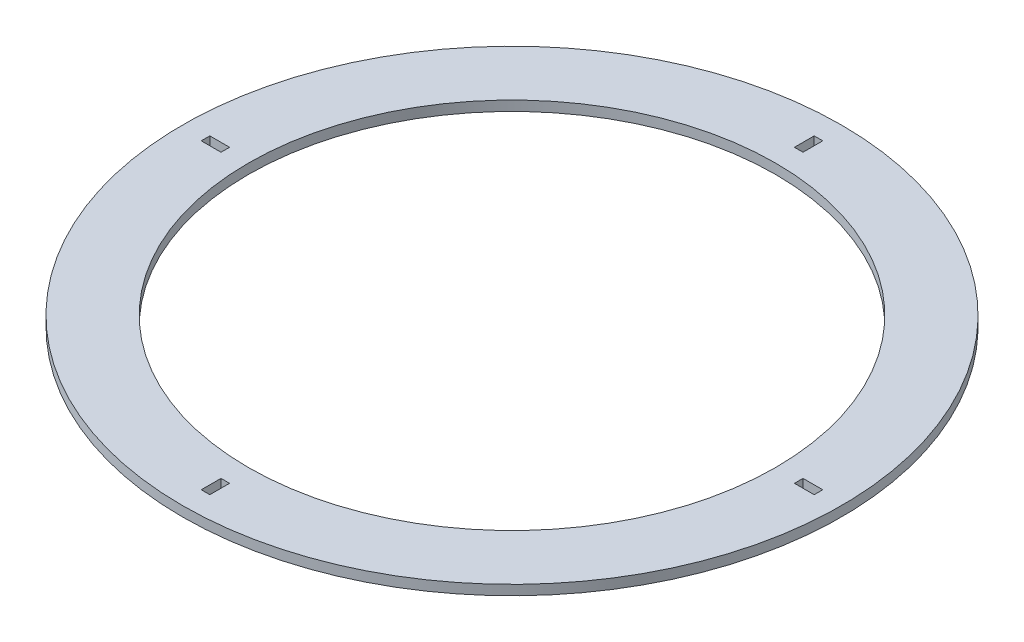
ISO-10303-21;
HEADER;
FILE_DESCRIPTION(('STEP AP214'),'2;1');
FILE_NAME('part.step','',(''),(''),'','','');
FILE_SCHEMA(('AUTOMOTIVE_DESIGN { 1 0 10303 214 1 1 1 1 }'));
ENDSEC;
DATA;
#1=APPLICATION_CONTEXT('core data for automotive mechanical design processes');
#2=APPLICATION_PROTOCOL_DEFINITION('international standard','automotive_design',2000,#1);
#3=PRODUCT_CONTEXT('',#1,'mechanical');
#4=PRODUCT('Part','Part','',(#3));
#5=PRODUCT_RELATED_PRODUCT_CATEGORY('part','',(#4));
#6=PRODUCT_DEFINITION_FORMATION('','',#4);
#7=PRODUCT_DEFINITION_CONTEXT('part definition',#1,'design');
#8=PRODUCT_DEFINITION('design','',#6,#7);
#9=PRODUCT_DEFINITION_SHAPE('','',#8);
#10=(LENGTH_UNIT() NAMED_UNIT(*) SI_UNIT(.MILLI.,.METRE.));
#11=(NAMED_UNIT(*) PLANE_ANGLE_UNIT() SI_UNIT($,.RADIAN.));
#12=(NAMED_UNIT(*) SI_UNIT($,.STERADIAN.) SOLID_ANGLE_UNIT());
#13=UNCERTAINTY_MEASURE_WITH_UNIT(LENGTH_MEASURE(1.E-05),#10,'distance_accuracy_value','');
#14=(GEOMETRIC_REPRESENTATION_CONTEXT(3) GLOBAL_UNCERTAINTY_ASSIGNED_CONTEXT((#13)) GLOBAL_UNIT_ASSIGNED_CONTEXT((#10,
#11,#12)) REPRESENTATION_CONTEXT('',''));
#15=CARTESIAN_POINT('',(0.,0.,0.));
#16=DIRECTION('',(0.,0.,1.));
#17=DIRECTION('',(1.,0.,0.));
#18=AXIS2_PLACEMENT_3D('',#15,#16,#17);
#19=CARTESIAN_POINT('',(0.,3.,0.));
#20=DIRECTION('',(0.,1.,0.));
#21=DIRECTION('',(0.,0.,1.));
#22=AXIS2_PLACEMENT_3D('',#19,#20,#21);
#23=PLANE('',#22);
#24=DIRECTION('',(-1.,0.,0.));
#25=VECTOR('',#24,1.);
#26=CARTESIAN_POINT('',(-93.,3.,-1.30000000000032));
#27=LINE('',#26,#25);
#28=CARTESIAN_POINT('',(-87.,3.,-1.3000000000003));
#29=VERTEX_POINT('',#28);
#30=CARTESIAN_POINT('',(-93.,3.,-1.30000000000032));
#31=VERTEX_POINT('',#30);
#32=EDGE_CURVE('E48',#29,#31,#27,.T.);
#33=ORIENTED_EDGE('',*,*,#32,.F.);
#34=DIRECTION('',(0.,0.,-1.));
#35=VECTOR('',#34,1.);
#36=CARTESIAN_POINT('',(-87.,3.,1.2999999999997));
#37=LINE('',#36,#35);
#38=CARTESIAN_POINT('',(-87.,3.,1.2999999999997));
#39=VERTEX_POINT('',#38);
#40=EDGE_CURVE('E167',#39,#29,#37,.T.);
#41=ORIENTED_EDGE('',*,*,#40,.F.);
#42=DIRECTION('',(1.,0.,0.));
#43=VECTOR('',#42,1.);
#44=CARTESIAN_POINT('',(-93.,3.,1.29999999999968));
#45=LINE('',#44,#43);
#46=CARTESIAN_POINT('',(-93.,3.,1.29999999999968));
#47=VERTEX_POINT('',#46);
#48=EDGE_CURVE('E170',#47,#39,#45,.T.);
#49=ORIENTED_EDGE('',*,*,#48,.F.);
#50=DIRECTION('',(0.,0.,1.));
#51=VECTOR('',#50,1.);
#52=CARTESIAN_POINT('',(-93.,3.,1.29999999999968));
#53=LINE('',#52,#51);
#54=EDGE_CURVE('E176',#31,#47,#53,.T.);
#55=ORIENTED_EDGE('',*,*,#54,.F.);
#56=EDGE_LOOP('',(#33,#41,#49,#55));
#57=FACE_BOUND('',#56,.T.);
#58=DIRECTION('',(0.,0.,-1.));
#59=VECTOR('',#58,1.);
#60=CARTESIAN_POINT('',(1.3,3.,-93.));
#61=LINE('',#60,#59);
#62=CARTESIAN_POINT('',(1.3,3.,-87.));
#63=VERTEX_POINT('',#62);
#64=CARTESIAN_POINT('',(1.3,3.,-93.));
#65=VERTEX_POINT('',#64);
#66=EDGE_CURVE('E56',#63,#65,#61,.T.);
#67=ORIENTED_EDGE('',*,*,#66,.F.);
#68=DIRECTION('',(1.,0.,0.));
#69=VECTOR('',#68,1.);
#70=CARTESIAN_POINT('',(-1.3,3.,-87.));
#71=LINE('',#70,#69);
#72=CARTESIAN_POINT('',(-1.3,3.,-87.));
#73=VERTEX_POINT('',#72);
#74=EDGE_CURVE('E191',#73,#63,#71,.T.);
#75=ORIENTED_EDGE('',*,*,#74,.F.);
#76=DIRECTION('',(0.,0.,1.));
#77=VECTOR('',#76,1.);
#78=CARTESIAN_POINT('',(-1.3,3.,-93.));
#79=LINE('',#78,#77);
#80=CARTESIAN_POINT('',(-1.3,3.,-93.));
#81=VERTEX_POINT('',#80);
#82=EDGE_CURVE('E206',#81,#73,#79,.T.);
#83=ORIENTED_EDGE('',*,*,#82,.F.);
#84=DIRECTION('',(-1.,0.,0.));
#85=VECTOR('',#84,1.);
#86=CARTESIAN_POINT('',(-1.3,3.,-93.));
#87=LINE('',#86,#85);
#88=EDGE_CURVE('E202',#65,#81,#87,.T.);
#89=ORIENTED_EDGE('',*,*,#88,.F.);
#90=EDGE_LOOP('',(#67,#75,#83,#89));
#91=FACE_BOUND('',#90,.T.);
#92=DIRECTION('',(1.,0.,0.));
#93=VECTOR('',#92,1.);
#94=CARTESIAN_POINT('',(93.,3.,1.30000000000097));
#95=LINE('',#94,#93);
#96=CARTESIAN_POINT('',(87.,3.,1.30000000000091));
#97=VERTEX_POINT('',#96);
#98=CARTESIAN_POINT('',(93.,3.,1.30000000000097));
#99=VERTEX_POINT('',#98);
#100=EDGE_CURVE('E231',#97,#99,#95,.T.);
#101=ORIENTED_EDGE('',*,*,#100,.F.);
#102=DIRECTION('',(0.,0.,1.));
#103=VECTOR('',#102,1.);
#104=CARTESIAN_POINT('',(87.,3.,-1.29999999999909));
#105=LINE('',#104,#103);
#106=CARTESIAN_POINT('',(87.,3.,-1.29999999999909));
#107=VERTEX_POINT('',#106);
#108=EDGE_CURVE('E221',#107,#97,#105,.T.);
#109=ORIENTED_EDGE('',*,*,#108,.F.);
#110=DIRECTION('',(-1.,0.,0.));
#111=VECTOR('',#110,1.);
#112=CARTESIAN_POINT('',(93.,3.,-1.29999999999903));
#113=LINE('',#112,#111);
#114=CARTESIAN_POINT('',(93.,3.,-1.29999999999903));
#115=VERTEX_POINT('',#114);
#116=EDGE_CURVE('E236',#115,#107,#113,.T.);
#117=ORIENTED_EDGE('',*,*,#116,.F.);
#118=DIRECTION('',(0.,0.,-1.));
#119=VECTOR('',#118,1.);
#120=CARTESIAN_POINT('',(93.,3.,-1.29999999999903));
#121=LINE('',#120,#119);
#122=EDGE_CURVE('E233',#99,#115,#121,.T.);
#123=ORIENTED_EDGE('',*,*,#122,.F.);
#124=EDGE_LOOP('',(#101,#109,#117,#123));
#125=FACE_BOUND('',#124,.T.);
#126=DIRECTION('',(0.,0.,1.));
#127=VECTOR('',#126,1.);
#128=CARTESIAN_POINT('',(-1.3,3.,93.));
#129=LINE('',#128,#127);
#130=CARTESIAN_POINT('',(-1.3,3.,87.));
#131=VERTEX_POINT('',#130);
#132=CARTESIAN_POINT('',(-1.3,3.,93.));
#133=VERTEX_POINT('',#132);
#134=EDGE_CURVE('E183',#131,#133,#129,.T.);
#135=ORIENTED_EDGE('',*,*,#134,.F.);
#136=DIRECTION('',(-1.,0.,0.));
#137=VECTOR('',#136,1.);
#138=CARTESIAN_POINT('',(1.3,3.,87.));
#139=LINE('',#138,#137);
#140=CARTESIAN_POINT('',(1.3,3.,87.));
#141=VERTEX_POINT('',#140);
#142=EDGE_CURVE('E252',#141,#131,#139,.T.);
#143=ORIENTED_EDGE('',*,*,#142,.F.);
#144=DIRECTION('',(0.,0.,-1.));
#145=VECTOR('',#144,1.);
#146=CARTESIAN_POINT('',(1.3,3.,93.));
#147=LINE('',#146,#145);
#148=CARTESIAN_POINT('',(1.3,3.,93.));
#149=VERTEX_POINT('',#148);
#150=EDGE_CURVE('E266',#149,#141,#147,.T.);
#151=ORIENTED_EDGE('',*,*,#150,.F.);
#152=DIRECTION('',(1.,0.,0.));
#153=VECTOR('',#152,1.);
#154=CARTESIAN_POINT('',(1.3,3.,93.));
#155=LINE('',#154,#153);
#156=EDGE_CURVE('E263',#133,#149,#155,.T.);
#157=ORIENTED_EDGE('',*,*,#156,.F.);
#158=EDGE_LOOP('',(#135,#143,#151,#157));
#159=FACE_BOUND('',#158,.T.);
#160=CARTESIAN_POINT('',(0.,3.,0.));
#161=DIRECTION('',(0.,1.,0.));
#162=DIRECTION('',(0.,0.,1.));
#163=AXIS2_PLACEMENT_3D('',#160,#161,#162);
#164=CIRCLE('',#163,100.);
#165=CARTESIAN_POINT('',(0.,3.,100.));
#166=VERTEX_POINT('',#165);
#167=EDGE_CURVE('E11',#166,#166,#164,.T.);
#168=ORIENTED_EDGE('',*,*,#167,.T.);
#169=EDGE_LOOP('',(#168));
#170=FACE_BOUND('',#169,.T.);
#171=CARTESIAN_POINT('',(0.,3.,0.));
#172=DIRECTION('',(0.,1.,0.));
#173=DIRECTION('',(0.,0.,1.));
#174=AXIS2_PLACEMENT_3D('',#171,#172,#173);
#175=CIRCLE('',#174,80.);
#176=CARTESIAN_POINT('',(0.,3.,80.));
#177=VERTEX_POINT('',#176);
#178=EDGE_CURVE('E280',#177,#177,#175,.T.);
#179=ORIENTED_EDGE('',*,*,#178,.F.);
#180=EDGE_LOOP('',(#179));
#181=FACE_BOUND('',#180,.T.);
#182=ADVANCED_FACE('F33',(#57,#91,#125,#159,#170,#181),#23,.T.);
#183=CARTESIAN_POINT('',(0.,0.,0.));
#184=DIRECTION('',(0.,1.,0.));
#185=DIRECTION('',(0.,0.,1.));
#186=AXIS2_PLACEMENT_3D('',#183,#184,#185);
#187=PLANE('',#186);
#188=DIRECTION('',(0.,0.,-1.));
#189=VECTOR('',#188,1.);
#190=CARTESIAN_POINT('',(-87.,0.,1.2999999999997));
#191=LINE('',#190,#189);
#192=CARTESIAN_POINT('',(-87.,0.,1.2999999999997));
#193=VERTEX_POINT('',#192);
#194=CARTESIAN_POINT('',(-87.,0.,-1.3000000000003));
#195=VERTEX_POINT('',#194);
#196=EDGE_CURVE('E154',#193,#195,#191,.T.);
#197=ORIENTED_EDGE('',*,*,#196,.T.);
#198=DIRECTION('',(-1.,0.,0.));
#199=VECTOR('',#198,1.);
#200=CARTESIAN_POINT('',(-93.,0.,-1.30000000000032));
#201=LINE('',#200,#199);
#202=CARTESIAN_POINT('',(-93.,0.,-1.30000000000032));
#203=VERTEX_POINT('',#202);
#204=EDGE_CURVE('E148',#195,#203,#201,.T.);
#205=ORIENTED_EDGE('',*,*,#204,.T.);
#206=DIRECTION('',(0.,0.,1.));
#207=VECTOR('',#206,1.);
#208=CARTESIAN_POINT('',(-93.,0.,1.29999999999968));
#209=LINE('',#208,#207);
#210=CARTESIAN_POINT('',(-93.,0.,1.29999999999968));
#211=VERTEX_POINT('',#210);
#212=EDGE_CURVE('E158',#203,#211,#209,.T.);
#213=ORIENTED_EDGE('',*,*,#212,.T.);
#214=DIRECTION('',(1.,0.,0.));
#215=VECTOR('',#214,1.);
#216=CARTESIAN_POINT('',(-93.,0.,1.29999999999968));
#217=LINE('',#216,#215);
#218=EDGE_CURVE('E162',#211,#193,#217,.T.);
#219=ORIENTED_EDGE('',*,*,#218,.T.);
#220=EDGE_LOOP('',(#197,#205,#213,#219));
#221=FACE_BOUND('',#220,.T.);
#222=DIRECTION('',(1.,0.,0.));
#223=VECTOR('',#222,1.);
#224=CARTESIAN_POINT('',(-1.3,0.,-87.));
#225=LINE('',#224,#223);
#226=CARTESIAN_POINT('',(-1.3,0.,-87.));
#227=VERTEX_POINT('',#226);
#228=CARTESIAN_POINT('',(1.3,0.,-87.));
#229=VERTEX_POINT('',#228);
#230=EDGE_CURVE('E197',#227,#229,#225,.T.);
#231=ORIENTED_EDGE('',*,*,#230,.T.);
#232=DIRECTION('',(0.,0.,-1.));
#233=VECTOR('',#232,1.);
#234=CARTESIAN_POINT('',(1.3,0.,-93.));
#235=LINE('',#234,#233);
#236=CARTESIAN_POINT('',(1.3,0.,-93.));
#237=VERTEX_POINT('',#236);
#238=EDGE_CURVE('E187',#229,#237,#235,.T.);
#239=ORIENTED_EDGE('',*,*,#238,.T.);
#240=DIRECTION('',(-1.,0.,0.));
#241=VECTOR('',#240,1.);
#242=CARTESIAN_POINT('',(-1.3,0.,-93.));
#243=LINE('',#242,#241);
#244=CARTESIAN_POINT('',(-1.3,0.,-93.));
#245=VERTEX_POINT('',#244);
#246=EDGE_CURVE('E190',#237,#245,#243,.T.);
#247=ORIENTED_EDGE('',*,*,#246,.T.);
#248=DIRECTION('',(0.,0.,1.));
#249=VECTOR('',#248,1.);
#250=CARTESIAN_POINT('',(-1.3,0.,-93.));
#251=LINE('',#250,#249);
#252=EDGE_CURVE('E194',#245,#227,#251,.T.);
#253=ORIENTED_EDGE('',*,*,#252,.T.);
#254=EDGE_LOOP('',(#231,#239,#247,#253));
#255=FACE_BOUND('',#254,.T.);
#256=DIRECTION('',(0.,0.,1.));
#257=VECTOR('',#256,1.);
#258=CARTESIAN_POINT('',(87.,0.,-1.29999999999909));
#259=LINE('',#258,#257);
#260=CARTESIAN_POINT('',(87.,0.,-1.29999999999909));
#261=VERTEX_POINT('',#260);
#262=CARTESIAN_POINT('',(87.,0.,1.30000000000091));
#263=VERTEX_POINT('',#262);
#264=EDGE_CURVE('E227',#261,#263,#259,.T.);
#265=ORIENTED_EDGE('',*,*,#264,.T.);
#266=DIRECTION('',(1.,0.,0.));
#267=VECTOR('',#266,1.);
#268=CARTESIAN_POINT('',(93.,0.,1.30000000000097));
#269=LINE('',#268,#267);
#270=CARTESIAN_POINT('',(93.,0.,1.30000000000097));
#271=VERTEX_POINT('',#270);
#272=EDGE_CURVE('E217',#263,#271,#269,.T.);
#273=ORIENTED_EDGE('',*,*,#272,.T.);
#274=DIRECTION('',(0.,0.,-1.));
#275=VECTOR('',#274,1.);
#276=CARTESIAN_POINT('',(93.,0.,-1.29999999999903));
#277=LINE('',#276,#275);
#278=CARTESIAN_POINT('',(93.,0.,-1.29999999999903));
#279=VERTEX_POINT('',#278);
#280=EDGE_CURVE('E220',#271,#279,#277,.T.);
#281=ORIENTED_EDGE('',*,*,#280,.T.);
#282=DIRECTION('',(-1.,0.,0.));
#283=VECTOR('',#282,1.);
#284=CARTESIAN_POINT('',(93.,0.,-1.29999999999903));
#285=LINE('',#284,#283);
#286=EDGE_CURVE('E224',#279,#261,#285,.T.);
#287=ORIENTED_EDGE('',*,*,#286,.T.);
#288=EDGE_LOOP('',(#265,#273,#281,#287));
#289=FACE_BOUND('',#288,.T.);
#290=DIRECTION('',(-1.,0.,0.));
#291=VECTOR('',#290,1.);
#292=CARTESIAN_POINT('',(1.3,0.,87.));
#293=LINE('',#292,#291);
#294=CARTESIAN_POINT('',(1.3,0.,87.));
#295=VERTEX_POINT('',#294);
#296=CARTESIAN_POINT('',(-1.3,0.,87.));
#297=VERTEX_POINT('',#296);
#298=EDGE_CURVE('E258',#295,#297,#293,.T.);
#299=ORIENTED_EDGE('',*,*,#298,.T.);
#300=DIRECTION('',(0.,0.,1.));
#301=VECTOR('',#300,1.);
#302=CARTESIAN_POINT('',(-1.3,0.,93.));
#303=LINE('',#302,#301);
#304=CARTESIAN_POINT('',(-1.3,0.,93.));
#305=VERTEX_POINT('',#304);
#306=EDGE_CURVE('E248',#297,#305,#303,.T.);
#307=ORIENTED_EDGE('',*,*,#306,.T.);
#308=DIRECTION('',(1.,0.,0.));
#309=VECTOR('',#308,1.);
#310=CARTESIAN_POINT('',(1.3,0.,93.));
#311=LINE('',#310,#309);
#312=CARTESIAN_POINT('',(1.3,0.,93.));
#313=VERTEX_POINT('',#312);
#314=EDGE_CURVE('E251',#305,#313,#311,.T.);
#315=ORIENTED_EDGE('',*,*,#314,.T.);
#316=DIRECTION('',(0.,0.,-1.));
#317=VECTOR('',#316,1.);
#318=CARTESIAN_POINT('',(1.3,0.,93.));
#319=LINE('',#318,#317);
#320=EDGE_CURVE('E255',#313,#295,#319,.T.);
#321=ORIENTED_EDGE('',*,*,#320,.T.);
#322=EDGE_LOOP('',(#299,#307,#315,#321));
#323=FACE_BOUND('',#322,.T.);
#324=CARTESIAN_POINT('',(0.,0.,0.));
#325=DIRECTION('',(0.,1.,0.));
#326=DIRECTION('',(0.,0.,1.));
#327=AXIS2_PLACEMENT_3D('',#324,#325,#326);
#328=CIRCLE('',#327,100.);
#329=CARTESIAN_POINT('',(0.,0.,100.));
#330=VERTEX_POINT('',#329);
#331=EDGE_CURVE('E37',#330,#330,#328,.T.);
#332=ORIENTED_EDGE('',*,*,#331,.F.);
#333=EDGE_LOOP('',(#332));
#334=FACE_BOUND('',#333,.T.);
#335=CARTESIAN_POINT('',(0.,0.,0.));
#336=DIRECTION('',(0.,1.,0.));
#337=DIRECTION('',(0.,0.,1.));
#338=AXIS2_PLACEMENT_3D('',#335,#336,#337);
#339=CIRCLE('',#338,80.);
#340=CARTESIAN_POINT('',(0.,0.,80.));
#341=VERTEX_POINT('',#340);
#342=EDGE_CURVE('E273',#341,#341,#339,.T.);
#343=ORIENTED_EDGE('',*,*,#342,.T.);
#344=EDGE_LOOP('',(#343));
#345=FACE_BOUND('',#344,.T.);
#346=ADVANCED_FACE('F164',(#221,#255,#289,#323,#334,#345),#187,.F.);
#347=CARTESIAN_POINT('',(0.,3.,0.));
#348=DIRECTION('',(0.,-1.,0.));
#349=DIRECTION('',(0.,0.,-1.));
#350=AXIS2_PLACEMENT_3D('',#347,#348,#349);
#351=CYLINDRICAL_SURFACE('',#350,100.);
#352=ORIENTED_EDGE('',*,*,#167,.F.);
#353=EDGE_LOOP('',(#352));
#354=FACE_BOUND('',#353,.T.);
#355=ORIENTED_EDGE('',*,*,#331,.T.);
#356=EDGE_LOOP('',(#355));
#357=FACE_BOUND('',#356,.T.);
#358=ADVANCED_FACE('F35',(#354,#357),#351,.T.);
#359=CARTESIAN_POINT('',(0.,3.,0.));
#360=DIRECTION('',(0.,-1.,0.));
#361=DIRECTION('',(0.,0.,-1.));
#362=AXIS2_PLACEMENT_3D('',#359,#360,#361);
#363=CYLINDRICAL_SURFACE('',#362,80.);
#364=ORIENTED_EDGE('',*,*,#178,.T.);
#365=EDGE_LOOP('',(#364));
#366=FACE_BOUND('',#365,.T.);
#367=ORIENTED_EDGE('',*,*,#342,.F.);
#368=EDGE_LOOP('',(#367));
#369=FACE_BOUND('',#368,.T.);
#370=ADVANCED_FACE('F287',(#366,#369),#363,.F.);
#371=CARTESIAN_POINT('',(-1.3,0.,93.));
#372=DIRECTION('',(-1.,0.,0.));
#373=DIRECTION('',(0.,0.,1.));
#374=AXIS2_PLACEMENT_3D('',#371,#372,#373);
#375=PLANE('',#374);
#376=ORIENTED_EDGE('',*,*,#134,.T.);
#377=DIRECTION('',(0.,1.,0.));
#378=VECTOR('',#377,1.);
#379=CARTESIAN_POINT('',(-1.3,0.,93.));
#380=LINE('',#379,#378);
#381=EDGE_CURVE('E261',#305,#133,#380,.T.);
#382=ORIENTED_EDGE('',*,*,#381,.F.);
#383=ORIENTED_EDGE('',*,*,#306,.F.);
#384=DIRECTION('',(0.,1.,0.));
#385=VECTOR('',#384,1.);
#386=CARTESIAN_POINT('',(-1.3,0.,87.));
#387=LINE('',#386,#385);
#388=EDGE_CURVE('E271',#297,#131,#387,.T.);
#389=ORIENTED_EDGE('',*,*,#388,.T.);
#390=EDGE_LOOP('',(#376,#382,#383,#389));
#391=FACE_BOUND('',#390,.T.);
#392=ADVANCED_FACE('F289',(#391),#375,.F.);
#393=CARTESIAN_POINT('',(1.3,0.,87.));
#394=DIRECTION('',(0.,0.,-1.));
#395=DIRECTION('',(-1.,0.,0.));
#396=AXIS2_PLACEMENT_3D('',#393,#394,#395);
#397=PLANE('',#396);
#398=ORIENTED_EDGE('',*,*,#142,.T.);
#399=ORIENTED_EDGE('',*,*,#388,.F.);
#400=ORIENTED_EDGE('',*,*,#298,.F.);
#401=DIRECTION('',(0.,1.,0.));
#402=VECTOR('',#401,1.);
#403=CARTESIAN_POINT('',(1.3,0.,87.));
#404=LINE('',#403,#402);
#405=EDGE_CURVE('E274',#295,#141,#404,.T.);
#406=ORIENTED_EDGE('',*,*,#405,.T.);
#407=EDGE_LOOP('',(#398,#399,#400,#406));
#408=FACE_BOUND('',#407,.T.);
#409=ADVANCED_FACE('F296',(#408),#397,.F.);
#410=CARTESIAN_POINT('',(1.3,0.,93.));
#411=DIRECTION('',(1.,0.,0.));
#412=DIRECTION('',(0.,0.,-1.));
#413=AXIS2_PLACEMENT_3D('',#410,#411,#412);
#414=PLANE('',#413);
#415=ORIENTED_EDGE('',*,*,#150,.T.);
#416=ORIENTED_EDGE('',*,*,#405,.F.);
#417=ORIENTED_EDGE('',*,*,#320,.F.);
#418=DIRECTION('',(0.,1.,0.));
#419=VECTOR('',#418,1.);
#420=CARTESIAN_POINT('',(1.3,0.,93.));
#421=LINE('',#420,#419);
#422=EDGE_CURVE('E276',#313,#149,#421,.T.);
#423=ORIENTED_EDGE('',*,*,#422,.T.);
#424=EDGE_LOOP('',(#415,#416,#417,#423));
#425=FACE_BOUND('',#424,.T.);
#426=ADVANCED_FACE('F336',(#425),#414,.F.);
#427=CARTESIAN_POINT('',(1.3,0.,93.));
#428=DIRECTION('',(0.,0.,1.));
#429=DIRECTION('',(1.,0.,0.));
#430=AXIS2_PLACEMENT_3D('',#427,#428,#429);
#431=PLANE('',#430);
#432=ORIENTED_EDGE('',*,*,#156,.T.);
#433=ORIENTED_EDGE('',*,*,#422,.F.);
#434=ORIENTED_EDGE('',*,*,#314,.F.);
#435=ORIENTED_EDGE('',*,*,#381,.T.);
#436=EDGE_LOOP('',(#432,#433,#434,#435));
#437=FACE_BOUND('',#436,.T.);
#438=ADVANCED_FACE('F330',(#437),#431,.F.);
#439=CARTESIAN_POINT('',(93.,0.,1.30000000000097));
#440=DIRECTION('',(0.,0.,1.));
#441=DIRECTION('',(1.,0.,0.));
#442=AXIS2_PLACEMENT_3D('',#439,#440,#441);
#443=PLANE('',#442);
#444=ORIENTED_EDGE('',*,*,#100,.T.);
#445=DIRECTION('',(0.,1.,0.));
#446=VECTOR('',#445,1.);
#447=CARTESIAN_POINT('',(93.,0.,1.30000000000097));
#448=LINE('',#447,#446);
#449=EDGE_CURVE('E230',#271,#99,#448,.T.);
#450=ORIENTED_EDGE('',*,*,#449,.F.);
#451=ORIENTED_EDGE('',*,*,#272,.F.);
#452=DIRECTION('',(0.,1.,0.));
#453=VECTOR('',#452,1.);
#454=CARTESIAN_POINT('',(87.,0.,1.30000000000091));
#455=LINE('',#454,#453);
#456=EDGE_CURVE('E203',#263,#97,#455,.T.);
#457=ORIENTED_EDGE('',*,*,#456,.T.);
#458=EDGE_LOOP('',(#444,#450,#451,#457));
#459=FACE_BOUND('',#458,.T.);
#460=ADVANCED_FACE('F343',(#459),#443,.F.);
#461=CARTESIAN_POINT('',(87.,0.,-1.29999999999909));
#462=DIRECTION('',(-1.,0.,0.));
#463=DIRECTION('',(0.,0.,1.));
#464=AXIS2_PLACEMENT_3D('',#461,#462,#463);
#465=PLANE('',#464);
#466=ORIENTED_EDGE('',*,*,#108,.T.);
#467=ORIENTED_EDGE('',*,*,#456,.F.);
#468=ORIENTED_EDGE('',*,*,#264,.F.);
#469=DIRECTION('',(0.,1.,0.));
#470=VECTOR('',#469,1.);
#471=CARTESIAN_POINT('',(87.,0.,-1.29999999999909));
#472=LINE('',#471,#470);
#473=EDGE_CURVE('E242',#261,#107,#472,.T.);
#474=ORIENTED_EDGE('',*,*,#473,.T.);
#475=EDGE_LOOP('',(#466,#467,#468,#474));
#476=FACE_BOUND('',#475,.T.);
#477=ADVANCED_FACE('F349',(#476),#465,.F.);
#478=CARTESIAN_POINT('',(93.,0.,-1.29999999999903));
#479=DIRECTION('',(0.,0.,-1.));
#480=DIRECTION('',(-1.,0.,0.));
#481=AXIS2_PLACEMENT_3D('',#478,#479,#480);
#482=PLANE('',#481);
#483=ORIENTED_EDGE('',*,*,#116,.T.);
#484=ORIENTED_EDGE('',*,*,#473,.F.);
#485=ORIENTED_EDGE('',*,*,#286,.F.);
#486=DIRECTION('',(0.,1.,0.));
#487=VECTOR('',#486,1.);
#488=CARTESIAN_POINT('',(93.,0.,-1.29999999999903));
#489=LINE('',#488,#487);
#490=EDGE_CURVE('E244',#279,#115,#489,.T.);
#491=ORIENTED_EDGE('',*,*,#490,.T.);
#492=EDGE_LOOP('',(#483,#484,#485,#491));
#493=FACE_BOUND('',#492,.T.);
#494=ADVANCED_FACE('F355',(#493),#482,.F.);
#495=CARTESIAN_POINT('',(93.,0.,-1.29999999999903));
#496=DIRECTION('',(1.,0.,0.));
#497=DIRECTION('',(0.,0.,-1.));
#498=AXIS2_PLACEMENT_3D('',#495,#496,#497);
#499=PLANE('',#498);
#500=ORIENTED_EDGE('',*,*,#122,.T.);
#501=ORIENTED_EDGE('',*,*,#490,.F.);
#502=ORIENTED_EDGE('',*,*,#280,.F.);
#503=ORIENTED_EDGE('',*,*,#449,.T.);
#504=EDGE_LOOP('',(#500,#501,#502,#503));
#505=FACE_BOUND('',#504,.T.);
#506=ADVANCED_FACE('F351',(#505),#499,.F.);
#507=CARTESIAN_POINT('',(1.3,0.,-93.));
#508=DIRECTION('',(1.,0.,0.));
#509=DIRECTION('',(0.,0.,-1.));
#510=AXIS2_PLACEMENT_3D('',#507,#508,#509);
#511=PLANE('',#510);
#512=ORIENTED_EDGE('',*,*,#66,.T.);
#513=DIRECTION('',(0.,1.,0.));
#514=VECTOR('',#513,1.);
#515=CARTESIAN_POINT('',(1.3,0.,-93.));
#516=LINE('',#515,#514);
#517=EDGE_CURVE('E200',#237,#65,#516,.T.);
#518=ORIENTED_EDGE('',*,*,#517,.F.);
#519=ORIENTED_EDGE('',*,*,#238,.F.);
#520=DIRECTION('',(0.,1.,0.));
#521=VECTOR('',#520,1.);
#522=CARTESIAN_POINT('',(1.3,0.,-87.));
#523=LINE('',#522,#521);
#524=EDGE_CURVE('E177',#229,#63,#523,.T.);
#525=ORIENTED_EDGE('',*,*,#524,.T.);
#526=EDGE_LOOP('',(#512,#518,#519,#525));
#527=FACE_BOUND('',#526,.T.);
#528=ADVANCED_FACE('F354',(#527),#511,.F.);
#529=CARTESIAN_POINT('',(-1.3,0.,-87.));
#530=DIRECTION('',(0.,0.,1.));
#531=DIRECTION('',(1.,0.,0.));
#532=AXIS2_PLACEMENT_3D('',#529,#530,#531);
#533=PLANE('',#532);
#534=ORIENTED_EDGE('',*,*,#74,.T.);
#535=ORIENTED_EDGE('',*,*,#524,.F.);
#536=ORIENTED_EDGE('',*,*,#230,.F.);
#537=DIRECTION('',(0.,1.,0.));
#538=VECTOR('',#537,1.);
#539=CARTESIAN_POINT('',(-1.3,0.,-87.));
#540=LINE('',#539,#538);
#541=EDGE_CURVE('E212',#227,#73,#540,.T.);
#542=ORIENTED_EDGE('',*,*,#541,.T.);
#543=EDGE_LOOP('',(#534,#535,#536,#542));
#544=FACE_BOUND('',#543,.T.);
#545=ADVANCED_FACE('F365',(#544),#533,.F.);
#546=CARTESIAN_POINT('',(-1.3,0.,-93.));
#547=DIRECTION('',(-1.,0.,0.));
#548=DIRECTION('',(0.,0.,1.));
#549=AXIS2_PLACEMENT_3D('',#546,#547,#548);
#550=PLANE('',#549);
#551=ORIENTED_EDGE('',*,*,#82,.T.);
#552=ORIENTED_EDGE('',*,*,#541,.F.);
#553=ORIENTED_EDGE('',*,*,#252,.F.);
#554=DIRECTION('',(0.,1.,0.));
#555=VECTOR('',#554,1.);
#556=CARTESIAN_POINT('',(-1.3,0.,-93.));
#557=LINE('',#556,#555);
#558=EDGE_CURVE('E214',#245,#81,#557,.T.);
#559=ORIENTED_EDGE('',*,*,#558,.T.);
#560=EDGE_LOOP('',(#551,#552,#553,#559));
#561=FACE_BOUND('',#560,.T.);
#562=ADVANCED_FACE('F369',(#561),#550,.F.);
#563=CARTESIAN_POINT('',(-1.3,0.,-93.));
#564=DIRECTION('',(0.,0.,-1.));
#565=DIRECTION('',(-1.,0.,0.));
#566=AXIS2_PLACEMENT_3D('',#563,#564,#565);
#567=PLANE('',#566);
#568=ORIENTED_EDGE('',*,*,#88,.T.);
#569=ORIENTED_EDGE('',*,*,#558,.F.);
#570=ORIENTED_EDGE('',*,*,#246,.F.);
#571=ORIENTED_EDGE('',*,*,#517,.T.);
#572=EDGE_LOOP('',(#568,#569,#570,#571));
#573=FACE_BOUND('',#572,.T.);
#574=ADVANCED_FACE('F366',(#573),#567,.F.);
#575=CARTESIAN_POINT('',(-93.,0.,-1.30000000000032));
#576=DIRECTION('',(0.,0.,-1.));
#577=DIRECTION('',(-1.,0.,0.));
#578=AXIS2_PLACEMENT_3D('',#575,#576,#577);
#579=PLANE('',#578);
#580=ORIENTED_EDGE('',*,*,#32,.T.);
#581=DIRECTION('',(0.,1.,0.));
#582=VECTOR('',#581,1.);
#583=CARTESIAN_POINT('',(-93.,0.,-1.30000000000032));
#584=LINE('',#583,#582);
#585=EDGE_CURVE('E144',#203,#31,#584,.T.);
#586=ORIENTED_EDGE('',*,*,#585,.F.);
#587=ORIENTED_EDGE('',*,*,#204,.F.);
#588=DIRECTION('',(0.,1.,0.));
#589=VECTOR('',#588,1.);
#590=CARTESIAN_POINT('',(-87.,0.,-1.3000000000003));
#591=LINE('',#590,#589);
#592=EDGE_CURVE('E181',#195,#29,#591,.T.);
#593=ORIENTED_EDGE('',*,*,#592,.T.);
#594=EDGE_LOOP('',(#580,#586,#587,#593));
#595=FACE_BOUND('',#594,.T.);
#596=ADVANCED_FACE('F146',(#595),#579,.F.);
#597=CARTESIAN_POINT('',(-87.,0.,1.2999999999997));
#598=DIRECTION('',(1.,0.,0.));
#599=DIRECTION('',(0.,0.,-1.));
#600=AXIS2_PLACEMENT_3D('',#597,#598,#599);
#601=PLANE('',#600);
#602=ORIENTED_EDGE('',*,*,#40,.T.);
#603=ORIENTED_EDGE('',*,*,#592,.F.);
#604=ORIENTED_EDGE('',*,*,#196,.F.);
#605=DIRECTION('',(0.,1.,0.));
#606=VECTOR('',#605,1.);
#607=CARTESIAN_POINT('',(-87.,0.,1.2999999999997));
#608=LINE('',#607,#606);
#609=EDGE_CURVE('E184',#193,#39,#608,.T.);
#610=ORIENTED_EDGE('',*,*,#609,.T.);
#611=EDGE_LOOP('',(#602,#603,#604,#610));
#612=FACE_BOUND('',#611,.T.);
#613=ADVANCED_FACE('F379',(#612),#601,.F.);
#614=CARTESIAN_POINT('',(-93.,0.,1.29999999999968));
#615=DIRECTION('',(0.,0.,1.));
#616=DIRECTION('',(1.,0.,0.));
#617=AXIS2_PLACEMENT_3D('',#614,#615,#616);
#618=PLANE('',#617);
#619=ORIENTED_EDGE('',*,*,#48,.T.);
#620=ORIENTED_EDGE('',*,*,#609,.F.);
#621=ORIENTED_EDGE('',*,*,#218,.F.);
#622=DIRECTION('',(0.,1.,0.));
#623=VECTOR('',#622,1.);
#624=CARTESIAN_POINT('',(-93.,0.,1.29999999999968));
#625=LINE('',#624,#623);
#626=EDGE_CURVE('E153',#211,#47,#625,.T.);
#627=ORIENTED_EDGE('',*,*,#626,.T.);
#628=EDGE_LOOP('',(#619,#620,#621,#627));
#629=FACE_BOUND('',#628,.T.);
#630=ADVANCED_FACE('F382',(#629),#618,.F.);
#631=CARTESIAN_POINT('',(-93.,0.,1.29999999999968));
#632=DIRECTION('',(-1.,0.,0.));
#633=DIRECTION('',(0.,0.,1.));
#634=AXIS2_PLACEMENT_3D('',#631,#632,#633);
#635=PLANE('',#634);
#636=ORIENTED_EDGE('',*,*,#54,.T.);
#637=ORIENTED_EDGE('',*,*,#626,.F.);
#638=ORIENTED_EDGE('',*,*,#212,.F.);
#639=ORIENTED_EDGE('',*,*,#585,.T.);
#640=EDGE_LOOP('',(#636,#637,#638,#639));
#641=FACE_BOUND('',#640,.T.);
#642=ADVANCED_FACE('F159',(#641),#635,.F.);
#643=CLOSED_SHELL('',(#182,#346,#358,#370,#392,#409,#426,#438,#460,#477,#494,#506,#528,#545,
#562,#574,#596,#613,#630,#642));
#644=MANIFOLD_SOLID_BREP('B2',#643);
#645=ADVANCED_BREP_SHAPE_REPRESENTATION('',(#18,#644),#14);
#646=SHAPE_DEFINITION_REPRESENTATION(#9,#645);
ENDSEC;
END-ISO-10303-21;
